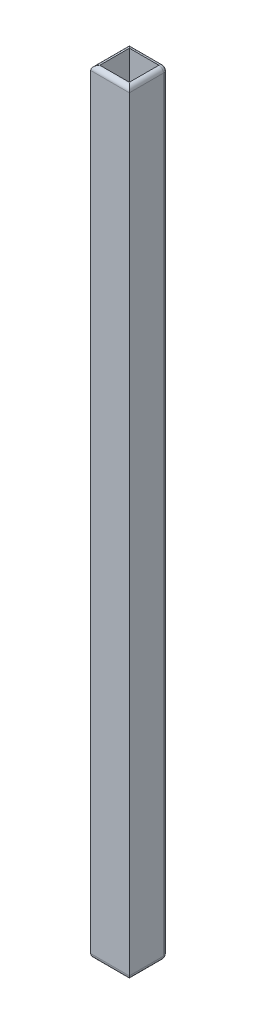
ISO-10303-21;
HEADER;
FILE_DESCRIPTION(('STEP AP214'),'2;1');
FILE_NAME('part.step','',(''),(''),'','','');
FILE_SCHEMA(('AUTOMOTIVE_DESIGN { 1 0 10303 214 1 1 1 1 }'));
ENDSEC;
DATA;
#1=APPLICATION_CONTEXT('core data for automotive mechanical design processes');
#2=APPLICATION_PROTOCOL_DEFINITION('international standard','automotive_design',2000,#1);
#3=PRODUCT_CONTEXT('',#1,'mechanical');
#4=PRODUCT('Part','Part','',(#3));
#5=PRODUCT_RELATED_PRODUCT_CATEGORY('part','',(#4));
#6=PRODUCT_DEFINITION_FORMATION('','',#4);
#7=PRODUCT_DEFINITION_CONTEXT('part definition',#1,'design');
#8=PRODUCT_DEFINITION('design','',#6,#7);
#9=PRODUCT_DEFINITION_SHAPE('','',#8);
#10=(LENGTH_UNIT() NAMED_UNIT(*) SI_UNIT(.MILLI.,.METRE.));
#11=(NAMED_UNIT(*) PLANE_ANGLE_UNIT() SI_UNIT($,.RADIAN.));
#12=(NAMED_UNIT(*) SI_UNIT($,.STERADIAN.) SOLID_ANGLE_UNIT());
#13=UNCERTAINTY_MEASURE_WITH_UNIT(LENGTH_MEASURE(1.E-05),#10,'distance_accuracy_value','');
#14=(GEOMETRIC_REPRESENTATION_CONTEXT(3) GLOBAL_UNCERTAINTY_ASSIGNED_CONTEXT((#13)) GLOBAL_UNIT_ASSIGNED_CONTEXT((#10,
#11,#12)) REPRESENTATION_CONTEXT('',''));
#15=CARTESIAN_POINT('',(0.,0.,0.));
#16=DIRECTION('',(0.,0.,1.));
#17=DIRECTION('',(1.,0.,0.));
#18=AXIS2_PLACEMENT_3D('',#15,#16,#17);
#19=CARTESIAN_POINT('',(4.25000000000002,85.1,4.24999999999999));
#20=DIRECTION('',(-1.,0.,0.));
#21=DIRECTION('',(0.,0.,1.));
#22=AXIS2_PLACEMENT_3D('',#19,#20,#21);
#23=PLANE('',#22);
#24=DIRECTION('',(0.,-1.,0.));
#25=VECTOR('',#24,1.);
#26=CARTESIAN_POINT('',(4.25000000000002,85.1,4.24999999999999));
#27=LINE('',#26,#25);
#28=CARTESIAN_POINT('',(4.25000000000002,84.1,4.24999999999999));
#29=VERTEX_POINT('',#28);
#30=CARTESIAN_POINT('',(4.25000000000002,-84.1,4.24999999999999));
#31=VERTEX_POINT('',#30);
#32=EDGE_CURVE('E130',#29,#31,#27,.T.);
#33=ORIENTED_EDGE('',*,*,#32,.T.);
#34=DIRECTION('',(0.,0.,-1.));
#35=VECTOR('',#34,1.);
#36=CARTESIAN_POINT('',(4.25000000000002,-84.1,-3.25));
#37=LINE('',#36,#35);
#38=CARTESIAN_POINT('',(4.25000000000002,-84.1,-3.25));
#39=VERTEX_POINT('',#38);
#40=EDGE_CURVE('E59',#31,#39,#37,.T.);
#41=ORIENTED_EDGE('',*,*,#40,.T.);
#42=DIRECTION('',(0.,-1.,0.));
#43=VECTOR('',#42,1.);
#44=CARTESIAN_POINT('',(4.25000000000002,85.1,-3.25));
#45=LINE('',#44,#43);
#46=CARTESIAN_POINT('',(4.25000000000002,84.1,-3.25));
#47=VERTEX_POINT('',#46);
#48=EDGE_CURVE('E184',#39,#47,#45,.F.);
#49=ORIENTED_EDGE('',*,*,#48,.T.);
#50=DIRECTION('',(0.,0.,-1.));
#51=VECTOR('',#50,1.);
#52=CARTESIAN_POINT('',(4.25000000000002,84.1,4.24999999999999));
#53=LINE('',#52,#51);
#54=EDGE_CURVE('E138',#47,#29,#53,.F.);
#55=ORIENTED_EDGE('',*,*,#54,.T.);
#56=EDGE_LOOP('',(#33,#41,#49,#55));
#57=FACE_BOUND('',#56,.T.);
#58=ADVANCED_FACE('F35',(#57),#23,.F.);
#59=CARTESIAN_POINT('',(-4.25,85.1,-4.25));
#60=DIRECTION('',(0.,0.,1.));
#61=DIRECTION('',(1.,0.,0.));
#62=AXIS2_PLACEMENT_3D('',#59,#60,#61);
#63=PLANE('',#62);
#64=DIRECTION('',(0.,-1.,0.));
#65=VECTOR('',#64,1.);
#66=CARTESIAN_POINT('',(3.25000000000002,85.1,-4.25));
#67=LINE('',#66,#65);
#68=CARTESIAN_POINT('',(3.25000000000002,84.1,-4.25));
#69=VERTEX_POINT('',#68);
#70=CARTESIAN_POINT('',(3.25000000000002,-84.1,-4.25));
#71=VERTEX_POINT('',#70);
#72=EDGE_CURVE('E182',#69,#71,#67,.T.);
#73=ORIENTED_EDGE('',*,*,#72,.T.);
#74=DIRECTION('',(-1.,0.,0.));
#75=VECTOR('',#74,1.);
#76=CARTESIAN_POINT('',(-4.25,-84.1,-4.25));
#77=LINE('',#76,#75);
#78=CARTESIAN_POINT('',(-4.25,-84.1,-4.25));
#79=VERTEX_POINT('',#78);
#80=EDGE_CURVE('E11',#71,#79,#77,.T.);
#81=ORIENTED_EDGE('',*,*,#80,.T.);
#82=DIRECTION('',(0.,-1.,0.));
#83=VECTOR('',#82,1.);
#84=CARTESIAN_POINT('',(-4.25,85.1,-4.25));
#85=LINE('',#84,#83);
#86=CARTESIAN_POINT('',(-4.25,84.1,-4.25));
#87=VERTEX_POINT('',#86);
#88=EDGE_CURVE('E179',#87,#79,#85,.T.);
#89=ORIENTED_EDGE('',*,*,#88,.F.);
#90=DIRECTION('',(-1.,0.,0.));
#91=VECTOR('',#90,1.);
#92=CARTESIAN_POINT('',(-4.25,84.1,-4.25));
#93=LINE('',#92,#91);
#94=EDGE_CURVE('E192',#87,#69,#93,.F.);
#95=ORIENTED_EDGE('',*,*,#94,.T.);
#96=EDGE_LOOP('',(#73,#81,#89,#95));
#97=FACE_BOUND('',#96,.T.);
#98=ADVANCED_FACE('F227',(#97),#63,.F.);
#99=CARTESIAN_POINT('',(-4.25,85.1,4.24999999999999));
#100=DIRECTION('',(1.,0.,0.));
#101=DIRECTION('',(0.,0.,-1.));
#102=AXIS2_PLACEMENT_3D('',#99,#100,#101);
#103=PLANE('',#102);
#104=ORIENTED_EDGE('',*,*,#88,.T.);
#105=DIRECTION('',(0.,0.,1.));
#106=VECTOR('',#105,1.);
#107=CARTESIAN_POINT('',(-4.25,-84.1,4.24999999999999));
#108=LINE('',#107,#106);
#109=CARTESIAN_POINT('',(-4.25,-84.1,4.24999999999999));
#110=VERTEX_POINT('',#109);
#111=EDGE_CURVE('E195',#79,#110,#108,.T.);
#112=ORIENTED_EDGE('',*,*,#111,.T.);
#113=DIRECTION('',(0.,-1.,0.));
#114=VECTOR('',#113,1.);
#115=CARTESIAN_POINT('',(-4.25,85.1,4.24999999999999));
#116=LINE('',#115,#114);
#117=CARTESIAN_POINT('',(-4.25,84.1,4.24999999999999));
#118=VERTEX_POINT('',#117);
#119=EDGE_CURVE('E176',#118,#110,#116,.T.);
#120=ORIENTED_EDGE('',*,*,#119,.F.);
#121=DIRECTION('',(0.,0.,1.));
#122=VECTOR('',#121,1.);
#123=CARTESIAN_POINT('',(-4.25,84.1,4.24999999999999));
#124=LINE('',#123,#122);
#125=EDGE_CURVE('E186',#118,#87,#124,.F.);
#126=ORIENTED_EDGE('',*,*,#125,.T.);
#127=EDGE_LOOP('',(#104,#112,#120,#126));
#128=FACE_BOUND('',#127,.T.);
#129=ADVANCED_FACE('F229',(#128),#103,.F.);
#130=CARTESIAN_POINT('',(-4.25,85.1,4.24999999999999));
#131=DIRECTION('',(0.,0.,-1.));
#132=DIRECTION('',(-1.,0.,0.));
#133=AXIS2_PLACEMENT_3D('',#130,#131,#132);
#134=PLANE('',#133);
#135=ORIENTED_EDGE('',*,*,#119,.T.);
#136=DIRECTION('',(1.,0.,0.));
#137=VECTOR('',#136,1.);
#138=CARTESIAN_POINT('',(4.25000000000002,-84.1,4.24999999999999));
#139=LINE('',#138,#137);
#140=EDGE_CURVE('E202',#110,#31,#139,.T.);
#141=ORIENTED_EDGE('',*,*,#140,.T.);
#142=ORIENTED_EDGE('',*,*,#32,.F.);
#143=DIRECTION('',(1.,0.,0.));
#144=VECTOR('',#143,1.);
#145=CARTESIAN_POINT('',(-4.25,84.1,4.24999999999999));
#146=LINE('',#145,#144);
#147=EDGE_CURVE('E189',#29,#118,#146,.F.);
#148=ORIENTED_EDGE('',*,*,#147,.T.);
#149=EDGE_LOOP('',(#135,#141,#142,#148));
#150=FACE_BOUND('',#149,.T.);
#151=ADVANCED_FACE('F254',(#150),#134,.F.);
#152=CARTESIAN_POINT('',(3.25000000000003,85.1,3.24999999999998));
#153=DIRECTION('',(-1.,0.,0.));
#154=DIRECTION('',(0.,0.,1.));
#155=AXIS2_PLACEMENT_3D('',#152,#153,#154);
#156=PLANE('',#155);
#157=DIRECTION('',(0.,0.,-1.));
#158=VECTOR('',#157,1.);
#159=CARTESIAN_POINT('',(3.25000000000003,-85.1,3.24999999999998));
#160=LINE('',#159,#158);
#161=CARTESIAN_POINT('',(3.25000000000003,-85.1,3.24999999999998));
#162=VERTEX_POINT('',#161);
#163=CARTESIAN_POINT('',(3.24999999999995,-85.1,-3.25));
#164=VERTEX_POINT('',#163);
#165=EDGE_CURVE('E141',#162,#164,#160,.T.);
#166=ORIENTED_EDGE('',*,*,#165,.F.);
#167=DIRECTION('',(0.,-1.,0.));
#168=VECTOR('',#167,1.);
#169=CARTESIAN_POINT('',(3.25000000000003,85.1,3.24999999999998));
#170=LINE('',#169,#168);
#171=CARTESIAN_POINT('',(3.25000000000003,85.1,3.24999999999998));
#172=VERTEX_POINT('',#171);
#173=EDGE_CURVE('E115',#172,#162,#170,.T.);
#174=ORIENTED_EDGE('',*,*,#173,.F.);
#175=DIRECTION('',(0.,0.,-1.));
#176=VECTOR('',#175,1.);
#177=CARTESIAN_POINT('',(3.25000000000003,85.1,3.24999999999998));
#178=LINE('',#177,#176);
#179=CARTESIAN_POINT('',(3.24999999999995,85.1,-3.25));
#180=VERTEX_POINT('',#179);
#181=EDGE_CURVE('E109',#172,#180,#178,.T.);
#182=ORIENTED_EDGE('',*,*,#181,.T.);
#183=DIRECTION('',(0.,-1.,0.));
#184=VECTOR('',#183,1.);
#185=CARTESIAN_POINT('',(3.24999999999995,85.1,-3.25));
#186=LINE('',#185,#184);
#187=EDGE_CURVE('E112',#180,#164,#186,.T.);
#188=ORIENTED_EDGE('',*,*,#187,.T.);
#189=EDGE_LOOP('',(#166,#174,#182,#188));
#190=FACE_BOUND('',#189,.T.);
#191=ADVANCED_FACE('F111',(#190),#156,.T.);
#192=CARTESIAN_POINT('',(-3.24999999999999,85.1,-3.25000000000006));
#193=DIRECTION('',(0.,0.,1.));
#194=DIRECTION('',(1.,0.,0.));
#195=AXIS2_PLACEMENT_3D('',#192,#193,#194);
#196=PLANE('',#195);
#197=DIRECTION('',(-1.,0.,0.));
#198=VECTOR('',#197,1.);
#199=CARTESIAN_POINT('',(-3.24999999999999,-85.1,-3.25000000000006));
#200=LINE('',#199,#198);
#201=CARTESIAN_POINT('',(-3.24999999999999,-85.1,-3.25000000000006));
#202=VERTEX_POINT('',#201);
#203=EDGE_CURVE('E129',#164,#202,#200,.T.);
#204=ORIENTED_EDGE('',*,*,#203,.F.);
#205=ORIENTED_EDGE('',*,*,#187,.F.);
#206=DIRECTION('',(-1.,0.,0.));
#207=VECTOR('',#206,1.);
#208=CARTESIAN_POINT('',(-3.24999999999999,85.1,-3.25000000000006));
#209=LINE('',#208,#207);
#210=CARTESIAN_POINT('',(-3.24999999999999,85.1,-3.25000000000006));
#211=VERTEX_POINT('',#210);
#212=EDGE_CURVE('E120',#180,#211,#209,.T.);
#213=ORIENTED_EDGE('',*,*,#212,.T.);
#214=DIRECTION('',(0.,-1.,0.));
#215=VECTOR('',#214,1.);
#216=CARTESIAN_POINT('',(-3.24999999999999,85.1,-3.25000000000006));
#217=LINE('',#216,#215);
#218=EDGE_CURVE('E131',#211,#202,#217,.T.);
#219=ORIENTED_EDGE('',*,*,#218,.T.);
#220=EDGE_LOOP('',(#204,#205,#213,#219));
#221=FACE_BOUND('',#220,.T.);
#222=ADVANCED_FACE('F124',(#221),#196,.T.);
#223=CARTESIAN_POINT('',(-3.24999999999997,85.1,3.24999999999998));
#224=DIRECTION('',(1.,0.,0.));
#225=DIRECTION('',(0.,0.,-1.));
#226=AXIS2_PLACEMENT_3D('',#223,#224,#225);
#227=PLANE('',#226);
#228=DIRECTION('',(0.,0.,1.));
#229=VECTOR('',#228,1.);
#230=CARTESIAN_POINT('',(-3.24999999999997,-85.1,3.24999999999998));
#231=LINE('',#230,#229);
#232=CARTESIAN_POINT('',(-3.24999999999997,-85.1,3.24999999999998));
#233=VERTEX_POINT('',#232);
#234=EDGE_CURVE('E166',#202,#233,#231,.T.);
#235=ORIENTED_EDGE('',*,*,#234,.F.);
#236=ORIENTED_EDGE('',*,*,#218,.F.);
#237=DIRECTION('',(0.,0.,1.));
#238=VECTOR('',#237,1.);
#239=CARTESIAN_POINT('',(-3.24999999999997,85.1,3.24999999999998));
#240=LINE('',#239,#238);
#241=CARTESIAN_POINT('',(-3.24999999999997,85.1,3.24999999999998));
#242=VERTEX_POINT('',#241);
#243=EDGE_CURVE('E156',#211,#242,#240,.T.);
#244=ORIENTED_EDGE('',*,*,#243,.T.);
#245=DIRECTION('',(0.,-1.,0.));
#246=VECTOR('',#245,1.);
#247=CARTESIAN_POINT('',(-3.24999999999997,85.1,3.24999999999998));
#248=LINE('',#247,#246);
#249=EDGE_CURVE('E172',#242,#233,#248,.T.);
#250=ORIENTED_EDGE('',*,*,#249,.T.);
#251=EDGE_LOOP('',(#235,#236,#244,#250));
#252=FACE_BOUND('',#251,.T.);
#253=ADVANCED_FACE('F245',(#252),#227,.T.);
#254=CARTESIAN_POINT('',(-3.24999999999997,85.1,3.24999999999998));
#255=DIRECTION('',(0.,0.,-1.));
#256=DIRECTION('',(-1.,0.,0.));
#257=AXIS2_PLACEMENT_3D('',#254,#255,#256);
#258=PLANE('',#257);
#259=DIRECTION('',(1.,0.,0.));
#260=VECTOR('',#259,1.);
#261=CARTESIAN_POINT('',(-3.24999999999997,-85.1,3.24999999999998));
#262=LINE('',#261,#260);
#263=EDGE_CURVE('E121',#233,#162,#262,.T.);
#264=ORIENTED_EDGE('',*,*,#263,.F.);
#265=ORIENTED_EDGE('',*,*,#249,.F.);
#266=DIRECTION('',(1.,0.,0.));
#267=VECTOR('',#266,1.);
#268=CARTESIAN_POINT('',(-3.24999999999997,85.1,3.24999999999998));
#269=LINE('',#268,#267);
#270=EDGE_CURVE('E159',#242,#172,#269,.T.);
#271=ORIENTED_EDGE('',*,*,#270,.T.);
#272=ORIENTED_EDGE('',*,*,#173,.T.);
#273=EDGE_LOOP('',(#264,#265,#271,#272));
#274=FACE_BOUND('',#273,.T.);
#275=ADVANCED_FACE('F242',(#274),#258,.T.);
#276=CARTESIAN_POINT('',(3.25000000000002,85.1,-3.25));
#277=DIRECTION('',(0.,-1.,0.));
#278=DIRECTION('',(0.,0.,-1.));
#279=AXIS2_PLACEMENT_3D('',#276,#277,#278);
#280=CYLINDRICAL_SURFACE('',#279,1.);
#281=ORIENTED_EDGE('',*,*,#48,.F.);
#282=CARTESIAN_POINT('',(3.25000000000002,-84.1,-3.25));
#283=DIRECTION('',(0.,-1.,0.));
#284=DIRECTION('',(0.,0.,-1.));
#285=AXIS2_PLACEMENT_3D('',#282,#283,#284);
#286=CIRCLE('',#285,1.);
#287=EDGE_CURVE('E44',#39,#71,#286,.F.);
#288=ORIENTED_EDGE('',*,*,#287,.T.);
#289=ORIENTED_EDGE('',*,*,#72,.F.);
#290=CARTESIAN_POINT('',(3.25000000000002,84.1,-3.25));
#291=DIRECTION('',(0.,-1.,0.));
#292=DIRECTION('',(0.,0.,-1.));
#293=AXIS2_PLACEMENT_3D('',#290,#291,#292);
#294=CIRCLE('',#293,1.);
#295=EDGE_CURVE('E147',#69,#47,#294,.T.);
#296=ORIENTED_EDGE('',*,*,#295,.T.);
#297=EDGE_LOOP('',(#281,#288,#289,#296));
#298=FACE_BOUND('',#297,.T.);
#299=ADVANCED_FACE('F255',(#298),#280,.T.);
#300=CARTESIAN_POINT('',(3.25000000000002,84.1,-3.25));
#301=DIRECTION('',(0.,-1.,0.));
#302=DIRECTION('',(0.,0.,-1.));
#303=AXIS2_PLACEMENT_3D('',#300,#301,#302);
#304=SPHERICAL_SURFACE('',#303,1.);
#305=CARTESIAN_POINT('',(3.25000000000002,84.1,-3.25));
#306=DIRECTION('',(-1.,0.,0.));
#307=DIRECTION('',(0.,0.,1.));
#308=AXIS2_PLACEMENT_3D('',#305,#306,#307);
#309=CIRCLE('',#308,1.);
#310=EDGE_CURVE('E142',#180,#69,#309,.T.);
#311=ORIENTED_EDGE('',*,*,#310,.F.);
#312=CARTESIAN_POINT('',(3.25000000000002,84.1,-3.25));
#313=DIRECTION('',(0.,0.,1.));
#314=DIRECTION('',(1.,0.,0.));
#315=AXIS2_PLACEMENT_3D('',#312,#313,#314);
#316=CIRCLE('',#315,1.);
#317=EDGE_CURVE('E135',#47,#180,#316,.T.);
#318=ORIENTED_EDGE('',*,*,#317,.F.);
#319=ORIENTED_EDGE('',*,*,#295,.F.);
#320=EDGE_LOOP('',(#311,#318,#319));
#321=FACE_BOUND('',#320,.T.);
#322=ADVANCED_FACE('F145',(#321),#304,.T.);
#323=CARTESIAN_POINT('',(3.25000000000002,84.1,0.));
#324=DIRECTION('',(0.,0.,-1.));
#325=DIRECTION('',(-1.,0.,0.));
#326=AXIS2_PLACEMENT_3D('',#323,#324,#325);
#327=CYLINDRICAL_SURFACE('',#326,1.);
#328=ORIENTED_EDGE('',*,*,#317,.T.);
#329=ORIENTED_EDGE('',*,*,#181,.F.);
#330=CARTESIAN_POINT('',(3.25000000000002,84.1,3.24999999999999));
#331=DIRECTION('',(0.707106781186547,0.,-0.707106781186547));
#332=DIRECTION('',(-0.707106781186547,0.,-0.707106781186547));
#333=AXIS2_PLACEMENT_3D('',#330,#331,#332);
#334=ELLIPSE('',#333,1.41421356237309,1.);
#335=EDGE_CURVE('E150',#29,#172,#334,.F.);
#336=ORIENTED_EDGE('',*,*,#335,.F.);
#337=ORIENTED_EDGE('',*,*,#54,.F.);
#338=EDGE_LOOP('',(#328,#329,#336,#337));
#339=FACE_BOUND('',#338,.T.);
#340=ADVANCED_FACE('F137',(#339),#327,.T.);
#341=CARTESIAN_POINT('',(0.,84.1,-3.25));
#342=DIRECTION('',(-1.,0.,0.));
#343=DIRECTION('',(0.,0.,1.));
#344=AXIS2_PLACEMENT_3D('',#341,#342,#343);
#345=CYLINDRICAL_SURFACE('',#344,1.);
#346=ORIENTED_EDGE('',*,*,#310,.T.);
#347=ORIENTED_EDGE('',*,*,#94,.F.);
#348=CARTESIAN_POINT('',(-3.25,84.1,-3.25));
#349=DIRECTION('',(-0.707106781186547,0.,0.707106781186547));
#350=DIRECTION('',(-0.707106781186547,0.,-0.707106781186547));
#351=AXIS2_PLACEMENT_3D('',#348,#349,#350);
#352=ELLIPSE('',#351,1.41421356237309,1.);
#353=EDGE_CURVE('E154',#211,#87,#352,.T.);
#354=ORIENTED_EDGE('',*,*,#353,.F.);
#355=ORIENTED_EDGE('',*,*,#212,.F.);
#356=EDGE_LOOP('',(#346,#347,#354,#355));
#357=FACE_BOUND('',#356,.T.);
#358=ADVANCED_FACE('F153',(#357),#345,.T.);
#359=CARTESIAN_POINT('',(0.,84.1,3.24999999999999));
#360=DIRECTION('',(1.,0.,0.));
#361=DIRECTION('',(0.,0.,-1.));
#362=AXIS2_PLACEMENT_3D('',#359,#360,#361);
#363=CYLINDRICAL_SURFACE('',#362,1.);
#364=ORIENTED_EDGE('',*,*,#335,.T.);
#365=ORIENTED_EDGE('',*,*,#270,.F.);
#366=CARTESIAN_POINT('',(-3.25,84.1,3.24999999999999));
#367=DIRECTION('',(0.707106781186547,0.,0.707106781186547));
#368=DIRECTION('',(0.707106781186547,0.,-0.707106781186547));
#369=AXIS2_PLACEMENT_3D('',#366,#367,#368);
#370=ELLIPSE('',#369,1.41421356237309,1.);
#371=EDGE_CURVE('E196',#118,#242,#370,.F.);
#372=ORIENTED_EDGE('',*,*,#371,.F.);
#373=ORIENTED_EDGE('',*,*,#147,.F.);
#374=EDGE_LOOP('',(#364,#365,#372,#373));
#375=FACE_BOUND('',#374,.T.);
#376=ADVANCED_FACE('F238',(#375),#363,.T.);
#377=CARTESIAN_POINT('',(-3.25,84.1,0.));
#378=DIRECTION('',(0.,0.,1.));
#379=DIRECTION('',(1.,0.,0.));
#380=AXIS2_PLACEMENT_3D('',#377,#378,#379);
#381=CYLINDRICAL_SURFACE('',#380,1.);
#382=ORIENTED_EDGE('',*,*,#353,.T.);
#383=ORIENTED_EDGE('',*,*,#125,.F.);
#384=ORIENTED_EDGE('',*,*,#371,.T.);
#385=ORIENTED_EDGE('',*,*,#243,.F.);
#386=EDGE_LOOP('',(#382,#383,#384,#385));
#387=FACE_BOUND('',#386,.T.);
#388=ADVANCED_FACE('F234',(#387),#381,.T.);
#389=CARTESIAN_POINT('',(3.25000000000002,-84.1,-3.25));
#390=DIRECTION('',(0.,-1.,0.));
#391=DIRECTION('',(0.,0.,-1.));
#392=AXIS2_PLACEMENT_3D('',#389,#390,#391);
#393=SPHERICAL_SURFACE('',#392,1.);
#394=CARTESIAN_POINT('',(3.25000000000002,-84.1,-3.25));
#395=DIRECTION('',(-1.,0.,0.));
#396=DIRECTION('',(0.,0.,1.));
#397=AXIS2_PLACEMENT_3D('',#394,#395,#396);
#398=CIRCLE('',#397,1.);
#399=EDGE_CURVE('E212',#71,#164,#398,.T.);
#400=ORIENTED_EDGE('',*,*,#399,.F.);
#401=ORIENTED_EDGE('',*,*,#287,.F.);
#402=CARTESIAN_POINT('',(3.25000000000002,-84.1,-3.25));
#403=DIRECTION('',(0.,0.,1.));
#404=DIRECTION('',(1.,0.,0.));
#405=AXIS2_PLACEMENT_3D('',#402,#403,#404);
#406=CIRCLE('',#405,1.);
#407=EDGE_CURVE('E39',#164,#39,#406,.T.);
#408=ORIENTED_EDGE('',*,*,#407,.F.);
#409=EDGE_LOOP('',(#400,#401,#408));
#410=FACE_BOUND('',#409,.T.);
#411=ADVANCED_FACE('F37',(#410),#393,.T.);
#412=CARTESIAN_POINT('',(3.25000000000002,-84.1,4.24999999999999));
#413=DIRECTION('',(0.,0.,1.));
#414=DIRECTION('',(1.,0.,0.));
#415=AXIS2_PLACEMENT_3D('',#412,#413,#414);
#416=CYLINDRICAL_SURFACE('',#415,1.);
#417=ORIENTED_EDGE('',*,*,#407,.T.);
#418=ORIENTED_EDGE('',*,*,#40,.F.);
#419=CARTESIAN_POINT('',(3.25000000000002,-84.1,3.24999999999999));
#420=DIRECTION('',(-0.707106781186547,0.,0.707106781186547));
#421=DIRECTION('',(0.707106781186547,0.,0.707106781186547));
#422=AXIS2_PLACEMENT_3D('',#419,#420,#421);
#423=ELLIPSE('',#422,1.41421356237309,1.);
#424=EDGE_CURVE('E210',#162,#31,#423,.T.);
#425=ORIENTED_EDGE('',*,*,#424,.F.);
#426=ORIENTED_EDGE('',*,*,#165,.T.);
#427=EDGE_LOOP('',(#417,#418,#425,#426));
#428=FACE_BOUND('',#427,.T.);
#429=ADVANCED_FACE('F219',(#428),#416,.T.);
#430=CARTESIAN_POINT('',(-4.25,-84.1,-3.25));
#431=DIRECTION('',(1.,0.,0.));
#432=DIRECTION('',(0.,0.,-1.));
#433=AXIS2_PLACEMENT_3D('',#430,#431,#432);
#434=CYLINDRICAL_SURFACE('',#433,1.);
#435=ORIENTED_EDGE('',*,*,#399,.T.);
#436=ORIENTED_EDGE('',*,*,#203,.T.);
#437=CARTESIAN_POINT('',(-3.25,-84.1,-3.25));
#438=DIRECTION('',(0.707106781186547,0.,-0.707106781186547));
#439=DIRECTION('',(0.707106781186547,0.,0.707106781186547));
#440=AXIS2_PLACEMENT_3D('',#437,#438,#439);
#441=ELLIPSE('',#440,1.41421356237309,1.);
#442=EDGE_CURVE('E208',#79,#202,#441,.F.);
#443=ORIENTED_EDGE('',*,*,#442,.F.);
#444=ORIENTED_EDGE('',*,*,#80,.F.);
#445=EDGE_LOOP('',(#435,#436,#443,#444));
#446=FACE_BOUND('',#445,.T.);
#447=ADVANCED_FACE('F223',(#446),#434,.T.);
#448=CARTESIAN_POINT('',(-4.25,-84.1,3.24999999999999));
#449=DIRECTION('',(-1.,0.,0.));
#450=DIRECTION('',(0.,0.,1.));
#451=AXIS2_PLACEMENT_3D('',#448,#449,#450);
#452=CYLINDRICAL_SURFACE('',#451,1.);
#453=ORIENTED_EDGE('',*,*,#424,.T.);
#454=ORIENTED_EDGE('',*,*,#140,.F.);
#455=CARTESIAN_POINT('',(-3.25,-84.1,3.24999999999999));
#456=DIRECTION('',(-0.707106781186547,0.,-0.707106781186547));
#457=DIRECTION('',(-0.707106781186547,0.,0.707106781186547));
#458=AXIS2_PLACEMENT_3D('',#455,#456,#457);
#459=ELLIPSE('',#458,1.41421356237309,1.);
#460=EDGE_CURVE('E206',#233,#110,#459,.T.);
#461=ORIENTED_EDGE('',*,*,#460,.F.);
#462=ORIENTED_EDGE('',*,*,#263,.T.);
#463=EDGE_LOOP('',(#453,#454,#461,#462));
#464=FACE_BOUND('',#463,.T.);
#465=ADVANCED_FACE('F251',(#464),#452,.T.);
#466=CARTESIAN_POINT('',(-3.25,-84.1,4.24999999999999));
#467=DIRECTION('',(0.,0.,-1.));
#468=DIRECTION('',(-1.,0.,0.));
#469=AXIS2_PLACEMENT_3D('',#466,#467,#468);
#470=CYLINDRICAL_SURFACE('',#469,1.);
#471=ORIENTED_EDGE('',*,*,#442,.T.);
#472=ORIENTED_EDGE('',*,*,#234,.T.);
#473=ORIENTED_EDGE('',*,*,#460,.T.);
#474=ORIENTED_EDGE('',*,*,#111,.F.);
#475=EDGE_LOOP('',(#471,#472,#473,#474));
#476=FACE_BOUND('',#475,.T.);
#477=ADVANCED_FACE('F248',(#476),#470,.T.);
#478=CLOSED_SHELL('',(#58,#98,#129,#151,#191,#222,#253,#275,#299,#322,#340,#358,#376,#388,#411,
#429,#447,#465,#477));
#479=MANIFOLD_SOLID_BREP('B2',#478);
#480=ADVANCED_BREP_SHAPE_REPRESENTATION('',(#18,#479),#14);
#481=SHAPE_DEFINITION_REPRESENTATION(#9,#480);
ENDSEC;
END-ISO-10303-21;
